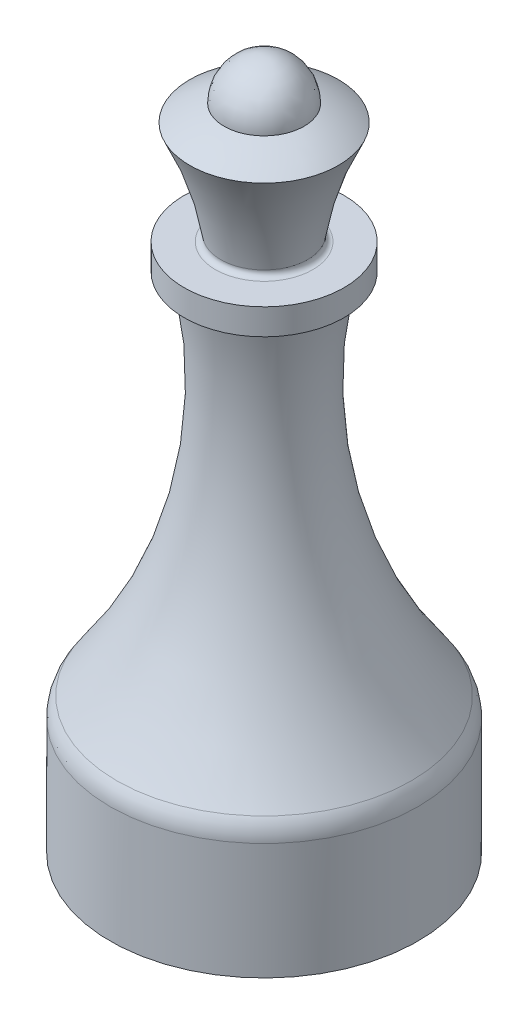
ISO-10303-21;
HEADER;
FILE_DESCRIPTION(('STEP AP214'),'2;1');
FILE_NAME('part.step','',(''),(''),'','','');
FILE_SCHEMA(('AUTOMOTIVE_DESIGN { 1 0 10303 214 1 1 1 1 }'));
ENDSEC;
DATA;
#1=APPLICATION_CONTEXT('core data for automotive mechanical design processes');
#2=APPLICATION_PROTOCOL_DEFINITION('international standard','automotive_design',2000,#1);
#3=PRODUCT_CONTEXT('',#1,'mechanical');
#4=PRODUCT('Part','Part','',(#3));
#5=PRODUCT_RELATED_PRODUCT_CATEGORY('part','',(#4));
#6=PRODUCT_DEFINITION_FORMATION('','',#4);
#7=PRODUCT_DEFINITION_CONTEXT('part definition',#1,'design');
#8=PRODUCT_DEFINITION('design','',#6,#7);
#9=PRODUCT_DEFINITION_SHAPE('','',#8);
#10=(LENGTH_UNIT() NAMED_UNIT(*) SI_UNIT(.MILLI.,.METRE.));
#11=(NAMED_UNIT(*) PLANE_ANGLE_UNIT() SI_UNIT($,.RADIAN.));
#12=(NAMED_UNIT(*) SI_UNIT($,.STERADIAN.) SOLID_ANGLE_UNIT());
#13=UNCERTAINTY_MEASURE_WITH_UNIT(LENGTH_MEASURE(1.E-05),#10,'distance_accuracy_value','');
#14=(GEOMETRIC_REPRESENTATION_CONTEXT(3) GLOBAL_UNCERTAINTY_ASSIGNED_CONTEXT((#13)) GLOBAL_UNIT_ASSIGNED_CONTEXT((#10,
#11,#12)) REPRESENTATION_CONTEXT('',''));
#15=CARTESIAN_POINT('',(0.,0.,0.));
#16=DIRECTION('',(0.,0.,1.));
#17=DIRECTION('',(1.,0.,0.));
#18=AXIS2_PLACEMENT_3D('',#15,#16,#17);
#19=CARTESIAN_POINT('',(0.,48.365140251301,0.));
#20=DIRECTION('',(0.,-1.,0.));
#21=DIRECTION('',(0.,0.,-1.));
#22=AXIS2_PLACEMENT_3D('',#19,#20,#21);
#23=DEGENERATE_TOROIDAL_SURFACE('',#22,0.412164800414568,13.4289835649094,.F.);
#24=CARTESIAN_POINT('',(0.,61.1277803089988,0.));
#25=DIRECTION('',(0.,-1.,0.));
#26=DIRECTION('',(0.,0.,-1.));
#27=AXIS2_PLACEMENT_3D('',#24,#25,#26);
#28=CIRCLE('',#27,3.76546830270156);
#29=CARTESIAN_POINT('',(0.,61.1277803089988,-3.76546830270156));
#30=VERTEX_POINT('',#29);
#31=EDGE_CURVE('E57',#30,#30,#28,.T.);
#32=ORIENTED_EDGE('',*,*,#31,.T.);
#33=EDGE_LOOP('',(#32));
#34=FACE_BOUND('',#33,.T.);
#35=CARTESIAN_POINT('',(0.,59.5593125652351,0.));
#36=DIRECTION('',(0.,-1.,0.));
#37=DIRECTION('',(0.,0.,-1.));
#38=AXIS2_PLACEMENT_3D('',#35,#36,#37);
#39=CIRCLE('',#38,7.00592833681125);
#40=CARTESIAN_POINT('',(0.,59.5593125652351,-7.00592833681125));
#41=VERTEX_POINT('',#40);
#42=EDGE_CURVE('E131',#41,#41,#39,.T.);
#43=ORIENTED_EDGE('',*,*,#42,.F.);
#44=EDGE_LOOP('',(#43));
#45=FACE_BOUND('',#44,.T.);
#46=ADVANCED_FACE('F36',(#34,#45),#23,.F.);
#47=CARTESIAN_POINT('',(0.,61.1804614873203,0.054089899568642));
#48=DIRECTION('',(-1.,0.,0.));
#49=DIRECTION('',(0.,0.,-1.));
#50=AXIS2_PLACEMENT_3D('',#47,#48,#49);
#51=CIRCLE('',#50,3.81992148703072);
#52=TRIMMED_CURVE('',#51,(PARAMETER_VALUE(-1.55663590295964)),
(PARAMETER_VALUE(1.55663590295964)),.T.,.PARAMETER.);
#53=CARTESIAN_POINT('',(0.,61.1804614873203,0.));
#54=DIRECTION('',(0.,-1.,0.));
#55=AXIS1_PLACEMENT('',#53,#54);
#56=SURFACE_OF_REVOLUTION('',#52,#55);
#57=CARTESIAN_POINT('',(0.,65.,0.));
#58=VERTEX_POINT('',#57);
#59=VERTEX_LOOP('',#58);
#60=FACE_BOUND('',#59,.T.);
#61=ORIENTED_EDGE('',*,*,#31,.F.);
#62=EDGE_LOOP('',(#61));
#63=FACE_BOUND('',#62,.T.);
#64=ADVANCED_FACE('F50',(#60,#63),#56,.T.);
#65=CARTESIAN_POINT('',(0.,17.2031473454012,0.));
#66=DIRECTION('',(0.,-1.,0.));
#67=DIRECTION('',(0.,0.,-1.));
#68=AXIS2_PLACEMENT_3D('',#65,#66,#67);
#69=CONICAL_SURFACE('',#68,8.00642889543069,0.559070976860497);
#70=CARTESIAN_POINT('',(0.,30.,0.));
#71=VERTEX_POINT('',#70);
#72=VERTEX_LOOP('',#71);
#73=FACE_BOUND('',#72,.T.);
#74=CARTESIAN_POINT('',(0.,17.2031473454012,0.));
#75=DIRECTION('',(0.,-1.,0.));
#76=DIRECTION('',(0.,0.,-1.));
#77=AXIS2_PLACEMENT_3D('',#74,#75,#76);
#78=CIRCLE('',#77,8.00642889543069);
#79=CARTESIAN_POINT('',(0.,17.2031473454012,-8.00642889543069));
#80=VERTEX_POINT('',#79);
#81=EDGE_CURVE('E60',#80,#80,#78,.T.);
#82=ORIENTED_EDGE('',*,*,#81,.T.);
#83=EDGE_LOOP('',(#82));
#84=FACE_BOUND('',#83,.T.);
#85=ADVANCED_FACE('F53',(#73,#84),#69,.F.);
#86=CARTESIAN_POINT('',(0.,12.,0.));
#87=DIRECTION('',(0.,-1.,0.));
#88=DIRECTION('',(0.,0.,-1.));
#89=AXIS2_PLACEMENT_3D('',#86,#87,#88);
#90=DEGENERATE_TOROIDAL_SURFACE('',#89,0.30987676204737,9.80987676204737,.F.);
#91=ORIENTED_EDGE('',*,*,#81,.F.);
#92=EDGE_LOOP('',(#91));
#93=FACE_BOUND('',#92,.T.);
#94=CARTESIAN_POINT('',(0.,12.,0.));
#95=DIRECTION('',(0.,-1.,0.));
#96=DIRECTION('',(0.,0.,-1.));
#97=AXIS2_PLACEMENT_3D('',#94,#95,#96);
#98=CIRCLE('',#97,9.5);
#99=CARTESIAN_POINT('',(0.,12.,-9.5));
#100=VERTEX_POINT('',#99);
#101=EDGE_CURVE('E66',#100,#100,#98,.T.);
#102=ORIENTED_EDGE('',*,*,#101,.T.);
#103=EDGE_LOOP('',(#102));
#104=FACE_BOUND('',#103,.T.);
#105=ADVANCED_FACE('F94',(#93,#104),#90,.T.);
#106=CARTESIAN_POINT('',(0.,0.,0.));
#107=DIRECTION('',(0.,-1.,0.));
#108=DIRECTION('',(0.,0.,-1.));
#109=AXIS2_PLACEMENT_3D('',#106,#107,#108);
#110=CYLINDRICAL_SURFACE('',#109,9.5);
#111=ORIENTED_EDGE('',*,*,#101,.F.);
#112=EDGE_LOOP('',(#111));
#113=FACE_BOUND('',#112,.T.);
#114=CARTESIAN_POINT('',(0.,0.,0.));
#115=DIRECTION('',(0.,-1.,0.));
#116=DIRECTION('',(0.,0.,-1.));
#117=AXIS2_PLACEMENT_3D('',#114,#115,#116);
#118=CIRCLE('',#117,9.5);
#119=CARTESIAN_POINT('',(0.,0.,-9.5));
#120=VERTEX_POINT('',#119);
#121=EDGE_CURVE('E146',#120,#120,#118,.T.);
#122=ORIENTED_EDGE('',*,*,#121,.T.);
#123=EDGE_LOOP('',(#122));
#124=FACE_BOUND('',#123,.T.);
#125=ADVANCED_FACE('F97',(#113,#124),#110,.F.);
#126=CARTESIAN_POINT('',(0.,0.,0.));
#127=DIRECTION('',(0.,-1.,0.));
#128=DIRECTION('',(0.,0.,-1.));
#129=AXIS2_PLACEMENT_3D('',#126,#127,#128);
#130=PLANE('',#129);
#131=CARTESIAN_POINT('',(0.,0.,0.));
#132=DIRECTION('',(0.,-1.,0.));
#133=DIRECTION('',(0.,0.,-1.));
#134=AXIS2_PLACEMENT_3D('',#131,#132,#133);
#135=CIRCLE('',#134,14.5);
#136=CARTESIAN_POINT('',(0.,0.,-14.5));
#137=VERTEX_POINT('',#136);
#138=EDGE_CURVE('E143',#137,#137,#135,.T.);
#139=ORIENTED_EDGE('',*,*,#138,.T.);
#140=EDGE_LOOP('',(#139));
#141=FACE_BOUND('',#140,.T.);
#142=ORIENTED_EDGE('',*,*,#121,.F.);
#143=EDGE_LOOP('',(#142));
#144=FACE_BOUND('',#143,.T.);
#145=ADVANCED_FACE('F101',(#141,#144),#130,.T.);
#146=CARTESIAN_POINT('',(0.,0.,0.));
#147=DIRECTION('',(0.,-1.,0.));
#148=DIRECTION('',(0.,0.,-1.));
#149=AXIS2_PLACEMENT_3D('',#146,#147,#148);
#150=CYLINDRICAL_SURFACE('',#149,14.5);
#151=CARTESIAN_POINT('',(0.,10.9708828066161,0.));
#152=DIRECTION('',(0.,1.,0.));
#153=DIRECTION('',(0.,0.,1.));
#154=AXIS2_PLACEMENT_3D('',#151,#152,#153);
#155=CIRCLE('',#154,14.5);
#156=CARTESIAN_POINT('',(0.,10.9708828066161,14.5));
#157=VERTEX_POINT('',#156);
#158=EDGE_CURVE('E59',#157,#157,#155,.F.);
#159=ORIENTED_EDGE('',*,*,#158,.T.);
#160=EDGE_LOOP('',(#159));
#161=FACE_BOUND('',#160,.T.);
#162=ORIENTED_EDGE('',*,*,#138,.F.);
#163=EDGE_LOOP('',(#162));
#164=FACE_BOUND('',#163,.T.);
#165=ADVANCED_FACE('F105',(#161,#164),#150,.T.);
#166=CARTESIAN_POINT('',(0.,38.5072108683021,0.));
#167=DIRECTION('',(0.,-1.,0.));
#168=DIRECTION('',(0.,0.,-1.));
#169=AXIS2_PLACEMENT_3D('',#166,#167,#168);
#170=TOROIDAL_SURFACE('',#169,47.7653693413957,42.5348918587564);
#171=CARTESIAN_POINT('',(0.,12.7850736570369,0.));
#172=DIRECTION('',(0.,1.,0.));
#173=DIRECTION('',(0.,0.,1.));
#174=AXIS2_PLACEMENT_3D('',#171,#172,#173);
#175=CIRCLE('',#174,13.889291015814);
#176=CARTESIAN_POINT('',(0.,12.7850736570369,13.889291015814));
#177=VERTEX_POINT('',#176);
#178=EDGE_CURVE('E63',#177,#177,#175,.T.);
#179=ORIENTED_EDGE('',*,*,#178,.T.);
#180=EDGE_LOOP('',(#179));
#181=FACE_BOUND('',#180,.T.);
#182=CARTESIAN_POINT('',(0.,46.5614612501134,0.));
#183=DIRECTION('',(0.,-1.,0.));
#184=DIRECTION('',(0.,0.,-1.));
#185=AXIS2_PLACEMENT_3D('',#182,#183,#184);
#186=CIRCLE('',#185,6.);
#187=CARTESIAN_POINT('',(0.,46.5614612501134,-6.));
#188=VERTEX_POINT('',#187);
#189=EDGE_CURVE('E140',#188,#188,#186,.T.);
#190=ORIENTED_EDGE('',*,*,#189,.T.);
#191=EDGE_LOOP('',(#190));
#192=FACE_BOUND('',#191,.T.);
#193=ADVANCED_FACE('F109',(#181,#192),#170,.F.);
#194=CARTESIAN_POINT('',(0.,46.5614612501134,0.));
#195=DIRECTION('',(0.,1.,0.));
#196=DIRECTION('',(0.,0.,1.));
#197=AXIS2_PLACEMENT_3D('',#194,#195,#196);
#198=CONICAL_SURFACE('',#197,6.,1.07325311448361);
#199=CARTESIAN_POINT('',(0.,47.3960002152082,0.));
#200=DIRECTION('',(0.,-1.,0.));
#201=DIRECTION('',(0.,0.,-1.));
#202=AXIS2_PLACEMENT_3D('',#199,#200,#201);
#203=CIRCLE('',#202,7.53657378823183);
#204=CARTESIAN_POINT('',(0.,47.3960002152082,-7.53657378823183));
#205=VERTEX_POINT('',#204);
#206=EDGE_CURVE('E135',#205,#205,#203,.T.);
#207=ORIENTED_EDGE('',*,*,#206,.T.);
#208=EDGE_LOOP('',(#207));
#209=FACE_BOUND('',#208,.T.);
#210=ORIENTED_EDGE('',*,*,#189,.F.);
#211=EDGE_LOOP('',(#210));
#212=FACE_BOUND('',#211,.T.);
#213=ADVANCED_FACE('F113',(#209,#212),#198,.T.);
#214=CARTESIAN_POINT('',(0.,0.,0.));
#215=DIRECTION('',(0.,-1.,0.));
#216=DIRECTION('',(0.,0.,-1.));
#217=AXIS2_PLACEMENT_3D('',#214,#215,#216);
#218=CYLINDRICAL_SURFACE('',#217,7.53657378823183);
#219=CARTESIAN_POINT('',(0.,49.844035403106,0.));
#220=DIRECTION('',(0.,-1.,0.));
#221=DIRECTION('',(0.,0.,-1.));
#222=AXIS2_PLACEMENT_3D('',#219,#220,#221);
#223=CIRCLE('',#222,7.53657378823183);
#224=CARTESIAN_POINT('',(0.,49.844035403106,-7.53657378823183));
#225=VERTEX_POINT('',#224);
#226=EDGE_CURVE('E132',#225,#225,#223,.T.);
#227=ORIENTED_EDGE('',*,*,#226,.T.);
#228=EDGE_LOOP('',(#227));
#229=FACE_BOUND('',#228,.T.);
#230=ORIENTED_EDGE('',*,*,#206,.F.);
#231=EDGE_LOOP('',(#230));
#232=FACE_BOUND('',#231,.T.);
#233=ADVANCED_FACE('F117',(#229,#232),#218,.T.);
#234=CARTESIAN_POINT('',(0.,49.844035403106,0.));
#235=DIRECTION('',(0.,1.,0.));
#236=DIRECTION('',(0.,0.,1.));
#237=AXIS2_PLACEMENT_3D('',#234,#235,#236);
#238=PLANE('',#237);
#239=CARTESIAN_POINT('',(0.,49.844035403106,0.));
#240=DIRECTION('',(0.,1.,0.));
#241=DIRECTION('',(0.,0.,1.));
#242=AXIS2_PLACEMENT_3D('',#239,#240,#241);
#243=CIRCLE('',#242,4.59048687515444);
#244=CARTESIAN_POINT('',(0.,49.844035403106,4.59048687515444));
#245=VERTEX_POINT('',#244);
#246=EDGE_CURVE('E44',#245,#245,#243,.F.);
#247=ORIENTED_EDGE('',*,*,#246,.T.);
#248=EDGE_LOOP('',(#247));
#249=FACE_BOUND('',#248,.T.);
#250=ORIENTED_EDGE('',*,*,#226,.F.);
#251=EDGE_LOOP('',(#250));
#252=FACE_BOUND('',#251,.T.);
#253=ADVANCED_FACE('F74',(#249,#252),#238,.T.);
#254=CARTESIAN_POINT('',(0.,45.9864528448489,0.));
#255=DIRECTION('',(0.,-1.,0.));
#256=DIRECTION('',(0.,0.,-1.));
#257=AXIS2_PLACEMENT_3D('',#254,#255,#256);
#258=TOROIDAL_SURFACE('',#257,33.8305586846501,30.0629891109896);
#259=CARTESIAN_POINT('',(0.,50.4177353686592,0.));
#260=DIRECTION('',(0.,-1.,0.));
#261=DIRECTION('',(0.,0.,-1.));
#262=AXIS2_PLACEMENT_3D('',#259,#260,#261);
#263=CIRCLE('',#262,4.09594838820174);
#264=CARTESIAN_POINT('',(0.,50.4177353686592,-4.09594838820174));
#265=VERTEX_POINT('',#264);
#266=EDGE_CURVE('E11',#265,#265,#263,.F.);
#267=ORIENTED_EDGE('',*,*,#266,.T.);
#268=EDGE_LOOP('',(#267));
#269=FACE_BOUND('',#268,.T.);
#270=ORIENTED_EDGE('',*,*,#42,.T.);
#271=EDGE_LOOP('',(#270));
#272=FACE_BOUND('',#271,.T.);
#273=ADVANCED_FACE('F83',(#269,#272),#258,.F.);
#274=CARTESIAN_POINT('',(0.,10.9708828066161,0.));
#275=DIRECTION('',(0.,1.,0.));
#276=DIRECTION('',(0.,0.,1.));
#277=AXIS2_PLACEMENT_3D('',#274,#275,#276);
#278=TOROIDAL_SURFACE('',#277,11.5,3.);
#279=ORIENTED_EDGE('',*,*,#178,.F.);
#280=EDGE_LOOP('',(#279));
#281=FACE_BOUND('',#280,.T.);
#282=ORIENTED_EDGE('',*,*,#158,.F.);
#283=EDGE_LOOP('',(#282));
#284=FACE_BOUND('',#283,.T.);
#285=ADVANCED_FACE('F78',(#281,#284),#278,.T.);
#286=CARTESIAN_POINT('',(0.,50.344035403106,0.));
#287=DIRECTION('',(0.,-1.,0.));
#288=DIRECTION('',(0.,0.,-1.));
#289=AXIS2_PLACEMENT_3D('',#286,#287,#288);
#290=TOROIDAL_SURFACE('',#289,4.59048687515444,0.5);
#291=ORIENTED_EDGE('',*,*,#266,.F.);
#292=EDGE_LOOP('',(#291));
#293=FACE_BOUND('',#292,.T.);
#294=ORIENTED_EDGE('',*,*,#246,.F.);
#295=EDGE_LOOP('',(#294));
#296=FACE_BOUND('',#295,.T.);
#297=ADVANCED_FACE('F38',(#293,#296),#290,.F.);
#298=CLOSED_SHELL('',(#46,#64,#85,#105,#125,#145,#165,#193,#213,#233,#253,#273,#285,#297));
#299=MANIFOLD_SOLID_BREP('B2',#298);
#300=ADVANCED_BREP_SHAPE_REPRESENTATION('',(#18,#299),#14);
#301=SHAPE_DEFINITION_REPRESENTATION(#9,#300);
ENDSEC;
END-ISO-10303-21;
